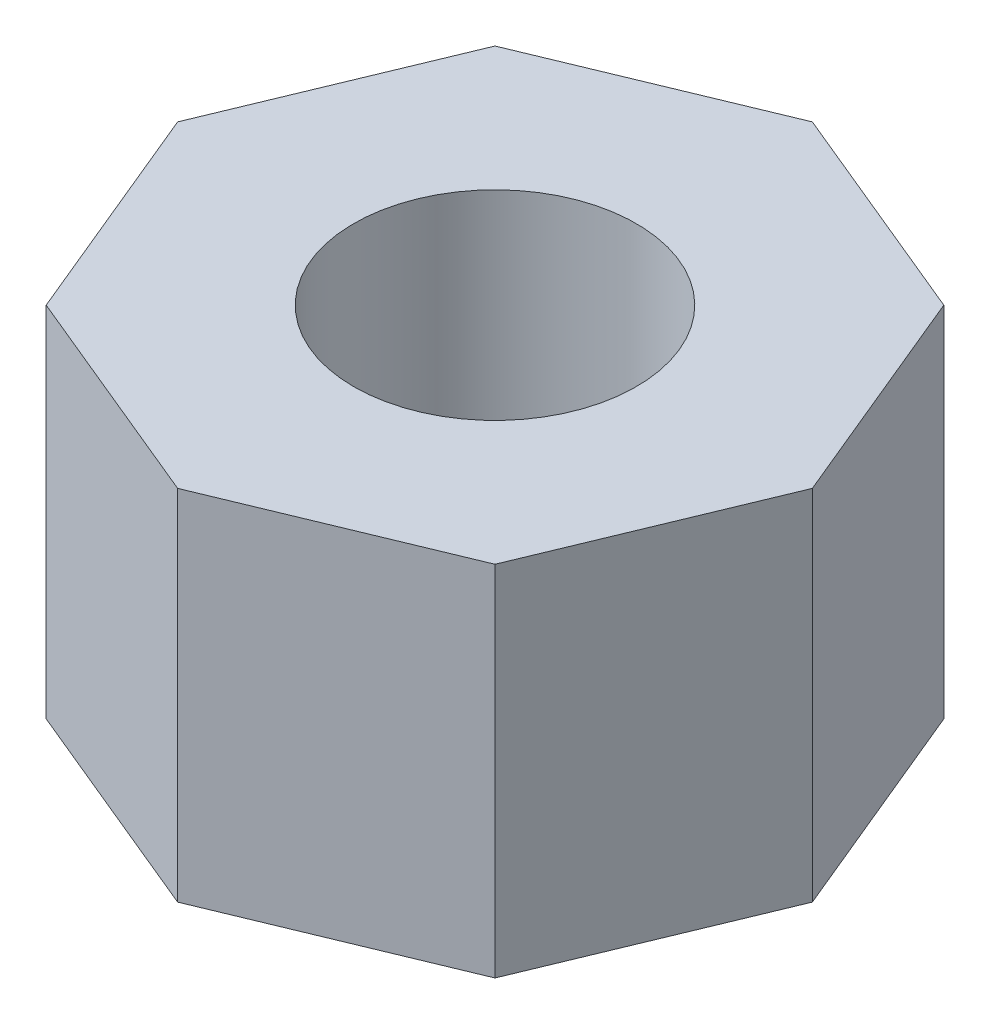
ISO-10303-21;
HEADER;
FILE_DESCRIPTION(('STEP AP214'),'2;1');
FILE_NAME('part.step','',(''),(''),'','','');
FILE_SCHEMA(('AUTOMOTIVE_DESIGN { 1 0 10303 214 1 1 1 1 }'));
ENDSEC;
DATA;
#1=APPLICATION_CONTEXT('core data for automotive mechanical design processes');
#2=APPLICATION_PROTOCOL_DEFINITION('international standard','automotive_design',2000,#1);
#3=PRODUCT_CONTEXT('',#1,'mechanical');
#4=PRODUCT('Part','Part','',(#3));
#5=PRODUCT_RELATED_PRODUCT_CATEGORY('part','',(#4));
#6=PRODUCT_DEFINITION_FORMATION('','',#4);
#7=PRODUCT_DEFINITION_CONTEXT('part definition',#1,'design');
#8=PRODUCT_DEFINITION('design','',#6,#7);
#9=PRODUCT_DEFINITION_SHAPE('','',#8);
#10=(LENGTH_UNIT() NAMED_UNIT(*) SI_UNIT(.MILLI.,.METRE.));
#11=(NAMED_UNIT(*) PLANE_ANGLE_UNIT() SI_UNIT($,.RADIAN.));
#12=(NAMED_UNIT(*) SI_UNIT($,.STERADIAN.) SOLID_ANGLE_UNIT());
#13=UNCERTAINTY_MEASURE_WITH_UNIT(LENGTH_MEASURE(1.E-05),#10,'distance_accuracy_value','');
#14=(GEOMETRIC_REPRESENTATION_CONTEXT(3) GLOBAL_UNCERTAINTY_ASSIGNED_CONTEXT((#13)) GLOBAL_UNIT_ASSIGNED_CONTEXT((#10,
#11,#12)) REPRESENTATION_CONTEXT('',''));
#15=CARTESIAN_POINT('',(0.,0.,0.));
#16=DIRECTION('',(0.,0.,1.));
#17=DIRECTION('',(1.,0.,0.));
#18=AXIS2_PLACEMENT_3D('',#15,#16,#17);
#19=CARTESIAN_POINT('',(0.,4.445,0.));
#20=DIRECTION('',(0.,1.,0.));
#21=DIRECTION('',(0.,0.,1.));
#22=AXIS2_PLACEMENT_3D('',#19,#20,#21);
#23=PLANE('',#22);
#24=DIRECTION('',(-0.923879532511291,0.,-0.382683432365079));
#25=VECTOR('',#24,1.);
#26=CARTESIAN_POINT('',(2.78387939753141,4.445,-2.78387939753147));
#27=LINE('',#26,#25);
#28=CARTESIAN_POINT('',(2.78387939753141,4.445,-2.78387939753147));
#29=VERTEX_POINT('',#28);
#30=CARTESIAN_POINT('',(0.,4.445,-3.937));
#31=VERTEX_POINT('',#30);
#32=EDGE_CURVE('E145',#29,#31,#27,.T.);
#33=ORIENTED_EDGE('',*,*,#32,.T.);
#34=DIRECTION('',(-0.923879532511282,0.,0.3826834323651));
#35=VECTOR('',#34,1.);
#36=CARTESIAN_POINT('',(0.,4.445,-3.937));
#37=LINE('',#36,#35);
#38=CARTESIAN_POINT('',(-2.78387939753147,4.445,-2.78387939753141));
#39=VERTEX_POINT('',#38);
#40=EDGE_CURVE('E93',#31,#39,#37,.T.);
#41=ORIENTED_EDGE('',*,*,#40,.T.);
#42=DIRECTION('',(-0.382683432365079,0.,0.923879532511291));
#43=VECTOR('',#42,1.);
#44=CARTESIAN_POINT('',(-2.78387939753147,4.445,-2.78387939753141));
#45=LINE('',#44,#43);
#46=CARTESIAN_POINT('',(-3.937,4.445,0.));
#47=VERTEX_POINT('',#46);
#48=EDGE_CURVE('E160',#39,#47,#45,.T.);
#49=ORIENTED_EDGE('',*,*,#48,.T.);
#50=DIRECTION('',(0.3826834323651,0.,0.923879532511283));
#51=VECTOR('',#50,1.);
#52=CARTESIAN_POINT('',(-3.937,4.445,0.));
#53=LINE('',#52,#51);
#54=CARTESIAN_POINT('',(-2.78387939753141,4.445,2.78387939753147));
#55=VERTEX_POINT('',#54);
#56=EDGE_CURVE('E173',#47,#55,#53,.T.);
#57=ORIENTED_EDGE('',*,*,#56,.T.);
#58=DIRECTION('',(0.923879532511291,0.,0.382683432365079));
#59=VECTOR('',#58,1.);
#60=CARTESIAN_POINT('',(-2.78387939753141,4.445,2.78387939753147));
#61=LINE('',#60,#59);
#62=CARTESIAN_POINT('',(0.,4.445,3.937));
#63=VERTEX_POINT('',#62);
#64=EDGE_CURVE('E112',#55,#63,#61,.T.);
#65=ORIENTED_EDGE('',*,*,#64,.T.);
#66=DIRECTION('',(0.923879532511283,0.,-0.3826834323651));
#67=VECTOR('',#66,1.);
#68=CARTESIAN_POINT('',(0.,4.445,3.937));
#69=LINE('',#68,#67);
#70=CARTESIAN_POINT('',(2.78387939753147,4.445,2.78387939753141));
#71=VERTEX_POINT('',#70);
#72=EDGE_CURVE('E106',#63,#71,#69,.T.);
#73=ORIENTED_EDGE('',*,*,#72,.T.);
#74=DIRECTION('',(0.382683432365079,0.,-0.923879532511291));
#75=VECTOR('',#74,1.);
#76=CARTESIAN_POINT('',(2.78387939753147,4.445,2.78387939753141));
#77=LINE('',#76,#75);
#78=CARTESIAN_POINT('',(3.937,4.445,0.));
#79=VERTEX_POINT('',#78);
#80=EDGE_CURVE('E110',#71,#79,#77,.T.);
#81=ORIENTED_EDGE('',*,*,#80,.T.);
#82=DIRECTION('',(-0.382683432365101,0.,-0.923879532511282));
#83=VECTOR('',#82,1.);
#84=CARTESIAN_POINT('',(3.937,4.445,0.));
#85=LINE('',#84,#83);
#86=EDGE_CURVE('E50',#79,#29,#85,.T.);
#87=ORIENTED_EDGE('',*,*,#86,.T.);
#88=EDGE_LOOP('',(#33,#41,#49,#57,#65,#73,#81,#87));
#89=FACE_BOUND('',#88,.T.);
#90=CARTESIAN_POINT('',(0.,4.445,0.));
#91=DIRECTION('',(0.,1.,0.));
#92=DIRECTION('',(0.,0.,1.));
#93=AXIS2_PLACEMENT_3D('',#90,#91,#92);
#94=CIRCLE('',#93,1.7526);
#95=CARTESIAN_POINT('',(0.,4.445,1.7526));
#96=VERTEX_POINT('',#95);
#97=EDGE_CURVE('E134',#96,#96,#94,.T.);
#98=ORIENTED_EDGE('',*,*,#97,.F.);
#99=EDGE_LOOP('',(#98));
#100=FACE_BOUND('',#99,.T.);
#101=ADVANCED_FACE('F33',(#89,#100),#23,.T.);
#102=CARTESIAN_POINT('',(0.,0.,0.));
#103=DIRECTION('',(0.,1.,0.));
#104=DIRECTION('',(0.,0.,1.));
#105=AXIS2_PLACEMENT_3D('',#102,#103,#104);
#106=PLANE('',#105);
#107=DIRECTION('',(-0.923879532511291,0.,-0.382683432365079));
#108=VECTOR('',#107,1.);
#109=CARTESIAN_POINT('',(2.78387939753141,0.,-2.78387939753147));
#110=LINE('',#109,#108);
#111=CARTESIAN_POINT('',(2.78387939753141,0.,-2.78387939753147));
#112=VERTEX_POINT('',#111);
#113=CARTESIAN_POINT('',(0.,0.,-3.937));
#114=VERTEX_POINT('',#113);
#115=EDGE_CURVE('E130',#112,#114,#110,.T.);
#116=ORIENTED_EDGE('',*,*,#115,.F.);
#117=DIRECTION('',(-0.382683432365101,0.,-0.923879532511282));
#118=VECTOR('',#117,1.);
#119=CARTESIAN_POINT('',(3.937,0.,0.));
#120=LINE('',#119,#118);
#121=CARTESIAN_POINT('',(3.937,0.,0.));
#122=VERTEX_POINT('',#121);
#123=EDGE_CURVE('E85',#122,#112,#120,.T.);
#124=ORIENTED_EDGE('',*,*,#123,.F.);
#125=DIRECTION('',(0.382683432365079,0.,-0.923879532511291));
#126=VECTOR('',#125,1.);
#127=CARTESIAN_POINT('',(2.78387939753147,0.,2.78387939753141));
#128=LINE('',#127,#126);
#129=CARTESIAN_POINT('',(2.78387939753147,0.,2.78387939753141));
#130=VERTEX_POINT('',#129);
#131=EDGE_CURVE('E79',#130,#122,#128,.T.);
#132=ORIENTED_EDGE('',*,*,#131,.F.);
#133=DIRECTION('',(0.923879532511283,0.,-0.3826834323651));
#134=VECTOR('',#133,1.);
#135=CARTESIAN_POINT('',(0.,0.,3.937));
#136=LINE('',#135,#134);
#137=CARTESIAN_POINT('',(0.,0.,3.937));
#138=VERTEX_POINT('',#137);
#139=EDGE_CURVE('E120',#138,#130,#136,.T.);
#140=ORIENTED_EDGE('',*,*,#139,.F.);
#141=DIRECTION('',(0.923879532511291,0.,0.382683432365079));
#142=VECTOR('',#141,1.);
#143=CARTESIAN_POINT('',(-2.78387939753141,0.,2.78387939753147));
#144=LINE('',#143,#142);
#145=CARTESIAN_POINT('',(-2.78387939753141,0.,2.78387939753147));
#146=VERTEX_POINT('',#145);
#147=EDGE_CURVE('E140',#146,#138,#144,.T.);
#148=ORIENTED_EDGE('',*,*,#147,.F.);
#149=DIRECTION('',(0.3826834323651,0.,0.923879532511283));
#150=VECTOR('',#149,1.);
#151=CARTESIAN_POINT('',(-3.937,0.,0.));
#152=LINE('',#151,#150);
#153=CARTESIAN_POINT('',(-3.937,0.,0.));
#154=VERTEX_POINT('',#153);
#155=EDGE_CURVE('E138',#154,#146,#152,.T.);
#156=ORIENTED_EDGE('',*,*,#155,.F.);
#157=DIRECTION('',(-0.382683432365079,0.,0.923879532511291));
#158=VECTOR('',#157,1.);
#159=CARTESIAN_POINT('',(-2.78387939753147,0.,-2.78387939753141));
#160=LINE('',#159,#158);
#161=CARTESIAN_POINT('',(-2.78387939753147,0.,-2.78387939753141));
#162=VERTEX_POINT('',#161);
#163=EDGE_CURVE('E136',#162,#154,#160,.T.);
#164=ORIENTED_EDGE('',*,*,#163,.F.);
#165=DIRECTION('',(-0.923879532511282,0.,0.3826834323651));
#166=VECTOR('',#165,1.);
#167=CARTESIAN_POINT('',(0.,0.,-3.937));
#168=LINE('',#167,#166);
#169=EDGE_CURVE('E133',#114,#162,#168,.T.);
#170=ORIENTED_EDGE('',*,*,#169,.F.);
#171=EDGE_LOOP('',(#116,#124,#132,#140,#148,#156,#164,#170));
#172=FACE_BOUND('',#171,.T.);
#173=CARTESIAN_POINT('',(0.,0.,0.));
#174=DIRECTION('',(0.,1.,0.));
#175=DIRECTION('',(0.,0.,1.));
#176=AXIS2_PLACEMENT_3D('',#173,#174,#175);
#177=CIRCLE('',#176,1.7526);
#178=CARTESIAN_POINT('',(0.,0.,1.7526));
#179=VERTEX_POINT('',#178);
#180=EDGE_CURVE('E179',#179,#179,#177,.T.);
#181=ORIENTED_EDGE('',*,*,#180,.T.);
#182=EDGE_LOOP('',(#181));
#183=FACE_BOUND('',#182,.T.);
#184=ADVANCED_FACE('F164',(#172,#183),#106,.F.);
#185=CARTESIAN_POINT('',(2.78387939753141,4.445,-2.78387939753147));
#186=DIRECTION('',(-0.382683432365079,0.,0.923879532511291));
#187=DIRECTION('',(0.923879532511291,0.,0.382683432365079));
#188=AXIS2_PLACEMENT_3D('',#185,#186,#187);
#189=PLANE('',#188);
#190=ORIENTED_EDGE('',*,*,#115,.T.);
#191=DIRECTION('',(0.,-1.,0.));
#192=VECTOR('',#191,1.);
#193=CARTESIAN_POINT('',(0.,4.445,-3.937));
#194=LINE('',#193,#192);
#195=EDGE_CURVE('E11',#31,#114,#194,.T.);
#196=ORIENTED_EDGE('',*,*,#195,.F.);
#197=ORIENTED_EDGE('',*,*,#32,.F.);
#198=DIRECTION('',(0.,-1.,0.));
#199=VECTOR('',#198,1.);
#200=CARTESIAN_POINT('',(2.78387939753141,4.445,-2.78387939753147));
#201=LINE('',#200,#199);
#202=EDGE_CURVE('E126',#29,#112,#201,.T.);
#203=ORIENTED_EDGE('',*,*,#202,.T.);
#204=EDGE_LOOP('',(#190,#196,#197,#203));
#205=FACE_BOUND('',#204,.T.);
#206=ADVANCED_FACE('F35',(#205),#189,.F.);
#207=CARTESIAN_POINT('',(0.,4.445,-3.937));
#208=DIRECTION('',(0.3826834323651,0.,0.923879532511282));
#209=DIRECTION('',(0.923879532511282,0.,-0.382683432365101));
#210=AXIS2_PLACEMENT_3D('',#207,#208,#209);
#211=PLANE('',#210);
#212=ORIENTED_EDGE('',*,*,#169,.T.);
#213=DIRECTION('',(0.,-1.,0.));
#214=VECTOR('',#213,1.);
#215=CARTESIAN_POINT('',(-2.78387939753147,4.445,-2.78387939753141));
#216=LINE('',#215,#214);
#217=EDGE_CURVE('E42',#39,#162,#216,.T.);
#218=ORIENTED_EDGE('',*,*,#217,.F.);
#219=ORIENTED_EDGE('',*,*,#40,.F.);
#220=ORIENTED_EDGE('',*,*,#195,.T.);
#221=EDGE_LOOP('',(#212,#218,#219,#220));
#222=FACE_BOUND('',#221,.T.);
#223=ADVANCED_FACE('F207',(#222),#211,.F.);
#224=CARTESIAN_POINT('',(-2.78387939753147,4.445,-2.78387939753141));
#225=DIRECTION('',(0.923879532511291,0.,0.382683432365079));
#226=DIRECTION('',(0.382683432365079,0.,-0.923879532511291));
#227=AXIS2_PLACEMENT_3D('',#224,#225,#226);
#228=PLANE('',#227);
#229=ORIENTED_EDGE('',*,*,#163,.T.);
#230=DIRECTION('',(0.,-1.,0.));
#231=VECTOR('',#230,1.);
#232=CARTESIAN_POINT('',(-3.937,4.445,0.));
#233=LINE('',#232,#231);
#234=EDGE_CURVE('E152',#47,#154,#233,.T.);
#235=ORIENTED_EDGE('',*,*,#234,.F.);
#236=ORIENTED_EDGE('',*,*,#48,.F.);
#237=ORIENTED_EDGE('',*,*,#217,.T.);
#238=EDGE_LOOP('',(#229,#235,#236,#237));
#239=FACE_BOUND('',#238,.T.);
#240=ADVANCED_FACE('F158',(#239),#228,.F.);
#241=CARTESIAN_POINT('',(-3.937,4.445,0.));
#242=DIRECTION('',(0.923879532511282,0.,-0.3826834323651));
#243=DIRECTION('',(-0.3826834323651,0.,-0.923879532511283));
#244=AXIS2_PLACEMENT_3D('',#241,#242,#243);
#245=PLANE('',#244);
#246=ORIENTED_EDGE('',*,*,#155,.T.);
#247=DIRECTION('',(0.,-1.,0.));
#248=VECTOR('',#247,1.);
#249=CARTESIAN_POINT('',(-2.78387939753141,4.445,2.78387939753147));
#250=LINE('',#249,#248);
#251=EDGE_CURVE('E149',#55,#146,#250,.T.);
#252=ORIENTED_EDGE('',*,*,#251,.F.);
#253=ORIENTED_EDGE('',*,*,#56,.F.);
#254=ORIENTED_EDGE('',*,*,#234,.T.);
#255=EDGE_LOOP('',(#246,#252,#253,#254));
#256=FACE_BOUND('',#255,.T.);
#257=ADVANCED_FACE('F169',(#256),#245,.F.);
#258=CARTESIAN_POINT('',(-2.78387939753141,4.445,2.78387939753147));
#259=DIRECTION('',(0.382683432365079,0.,-0.923879532511291));
#260=DIRECTION('',(-0.923879532511291,0.,-0.382683432365079));
#261=AXIS2_PLACEMENT_3D('',#258,#259,#260);
#262=PLANE('',#261);
#263=ORIENTED_EDGE('',*,*,#147,.T.);
#264=DIRECTION('',(0.,-1.,0.));
#265=VECTOR('',#264,1.);
#266=CARTESIAN_POINT('',(0.,4.445,3.937));
#267=LINE('',#266,#265);
#268=EDGE_CURVE('E121',#63,#138,#267,.T.);
#269=ORIENTED_EDGE('',*,*,#268,.F.);
#270=ORIENTED_EDGE('',*,*,#64,.F.);
#271=ORIENTED_EDGE('',*,*,#251,.T.);
#272=EDGE_LOOP('',(#263,#269,#270,#271));
#273=FACE_BOUND('',#272,.T.);
#274=ADVANCED_FACE('F172',(#273),#262,.F.);
#275=CARTESIAN_POINT('',(0.,4.445,3.937));
#276=DIRECTION('',(-0.3826834323651,0.,-0.923879532511282));
#277=DIRECTION('',(-0.923879532511283,0.,0.3826834323651));
#278=AXIS2_PLACEMENT_3D('',#275,#276,#277);
#279=PLANE('',#278);
#280=ORIENTED_EDGE('',*,*,#139,.T.);
#281=DIRECTION('',(0.,-1.,0.));
#282=VECTOR('',#281,1.);
#283=CARTESIAN_POINT('',(2.78387939753147,4.445,2.78387939753141));
#284=LINE('',#283,#282);
#285=EDGE_CURVE('E117',#71,#130,#284,.T.);
#286=ORIENTED_EDGE('',*,*,#285,.F.);
#287=ORIENTED_EDGE('',*,*,#72,.F.);
#288=ORIENTED_EDGE('',*,*,#268,.T.);
#289=EDGE_LOOP('',(#280,#286,#287,#288));
#290=FACE_BOUND('',#289,.T.);
#291=ADVANCED_FACE('F118',(#290),#279,.F.);
#292=CARTESIAN_POINT('',(2.78387939753147,4.445,2.78387939753141));
#293=DIRECTION('',(-0.923879532511291,0.,-0.382683432365079));
#294=DIRECTION('',(-0.382683432365079,0.,0.923879532511291));
#295=AXIS2_PLACEMENT_3D('',#292,#293,#294);
#296=PLANE('',#295);
#297=ORIENTED_EDGE('',*,*,#131,.T.);
#298=DIRECTION('',(0.,-1.,0.));
#299=VECTOR('',#298,1.);
#300=CARTESIAN_POINT('',(3.937,4.445,0.));
#301=LINE('',#300,#299);
#302=EDGE_CURVE('E122',#79,#122,#301,.T.);
#303=ORIENTED_EDGE('',*,*,#302,.F.);
#304=ORIENTED_EDGE('',*,*,#80,.F.);
#305=ORIENTED_EDGE('',*,*,#285,.T.);
#306=EDGE_LOOP('',(#297,#303,#304,#305));
#307=FACE_BOUND('',#306,.T.);
#308=ADVANCED_FACE('F124',(#307),#296,.F.);
#309=CARTESIAN_POINT('',(3.937,4.445,0.));
#310=DIRECTION('',(-0.923879532511282,0.,0.382683432365101));
#311=DIRECTION('',(0.382683432365101,0.,0.923879532511282));
#312=AXIS2_PLACEMENT_3D('',#309,#310,#311);
#313=PLANE('',#312);
#314=ORIENTED_EDGE('',*,*,#123,.T.);
#315=ORIENTED_EDGE('',*,*,#202,.F.);
#316=ORIENTED_EDGE('',*,*,#86,.F.);
#317=ORIENTED_EDGE('',*,*,#302,.T.);
#318=EDGE_LOOP('',(#314,#315,#316,#317));
#319=FACE_BOUND('',#318,.T.);
#320=ADVANCED_FACE('F195',(#319),#313,.F.);
#321=CARTESIAN_POINT('',(0.,4.445,0.));
#322=DIRECTION('',(0.,-1.,0.));
#323=DIRECTION('',(0.,0.,-1.));
#324=AXIS2_PLACEMENT_3D('',#321,#322,#323);
#325=CYLINDRICAL_SURFACE('',#324,1.7526);
#326=ORIENTED_EDGE('',*,*,#97,.T.);
#327=EDGE_LOOP('',(#326));
#328=FACE_BOUND('',#327,.T.);
#329=ORIENTED_EDGE('',*,*,#180,.F.);
#330=EDGE_LOOP('',(#329));
#331=FACE_BOUND('',#330,.T.);
#332=ADVANCED_FACE('F185',(#328,#331),#325,.F.);
#333=CLOSED_SHELL('',(#101,#184,#206,#223,#240,#257,#274,#291,#308,#320,#332));
#334=MANIFOLD_SOLID_BREP('B2',#333);
#335=ADVANCED_BREP_SHAPE_REPRESENTATION('',(#18,#334),#14);
#336=SHAPE_DEFINITION_REPRESENTATION(#9,#335);
ENDSEC;
END-ISO-10303-21;
